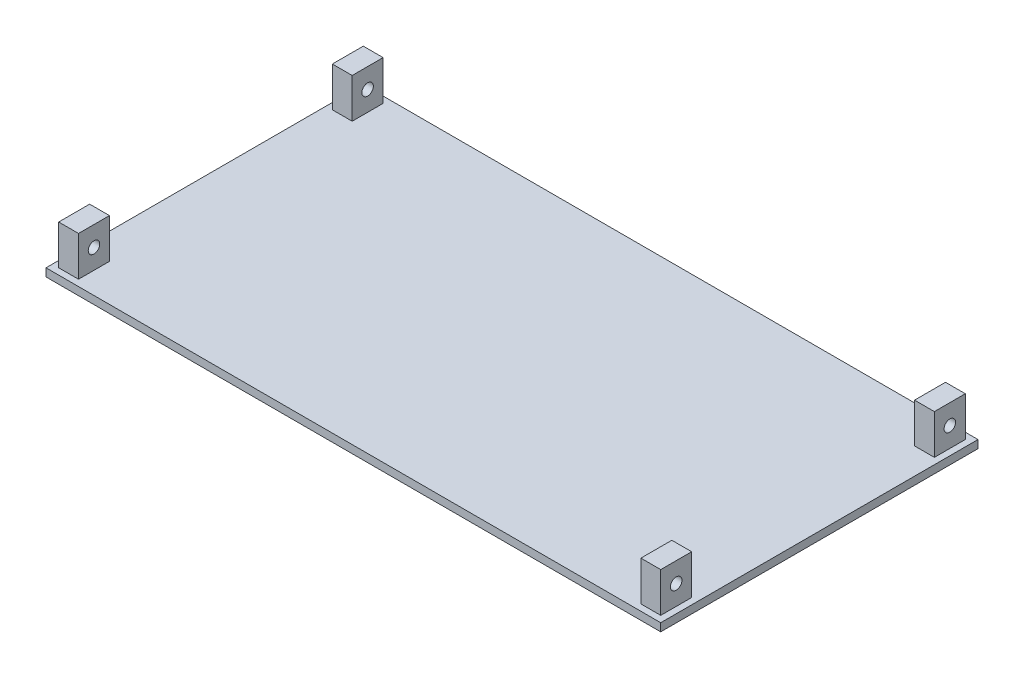
ISO-10303-21;
HEADER;
FILE_DESCRIPTION(('STEP AP214'),'2;1');
FILE_NAME('part.step','',(''),(''),'','','');
FILE_SCHEMA(('AUTOMOTIVE_DESIGN { 1 0 10303 214 1 1 1 1 }'));
ENDSEC;
DATA;
#1=APPLICATION_CONTEXT('core data for automotive mechanical design processes');
#2=APPLICATION_PROTOCOL_DEFINITION('international standard','automotive_design',2000,#1);
#3=PRODUCT_CONTEXT('',#1,'mechanical');
#4=PRODUCT('Part','Part','',(#3));
#5=PRODUCT_RELATED_PRODUCT_CATEGORY('part','',(#4));
#6=PRODUCT_DEFINITION_FORMATION('','',#4);
#7=PRODUCT_DEFINITION_CONTEXT('part definition',#1,'design');
#8=PRODUCT_DEFINITION('design','',#6,#7);
#9=PRODUCT_DEFINITION_SHAPE('','',#8);
#10=(LENGTH_UNIT() NAMED_UNIT(*) SI_UNIT(.MILLI.,.METRE.));
#11=(NAMED_UNIT(*) PLANE_ANGLE_UNIT() SI_UNIT($,.RADIAN.));
#12=(NAMED_UNIT(*) SI_UNIT($,.STERADIAN.) SOLID_ANGLE_UNIT());
#13=UNCERTAINTY_MEASURE_WITH_UNIT(LENGTH_MEASURE(1.E-05),#10,'distance_accuracy_value','');
#14=(GEOMETRIC_REPRESENTATION_CONTEXT(3) GLOBAL_UNCERTAINTY_ASSIGNED_CONTEXT((#13)) GLOBAL_UNIT_ASSIGNED_CONTEXT((#10,
#11,#12)) REPRESENTATION_CONTEXT('',''));
#15=CARTESIAN_POINT('',(0.,0.,0.));
#16=DIRECTION('',(0.,0.,1.));
#17=DIRECTION('',(1.,0.,0.));
#18=AXIS2_PLACEMENT_3D('',#15,#16,#17);
#19=CARTESIAN_POINT('',(0.,2.,0.));
#20=DIRECTION('',(0.,1.,0.));
#21=DIRECTION('',(0.,0.,1.));
#22=AXIS2_PLACEMENT_3D('',#19,#20,#21);
#23=PLANE('',#22);
#24=DIRECTION('',(0.,0.,-1.));
#25=VECTOR('',#24,1.);
#26=CARTESIAN_POINT('',(0.,2.,0.));
#27=LINE('',#26,#25);
#28=CARTESIAN_POINT('',(0.,2.,0.));
#29=VERTEX_POINT('',#28);
#30=CARTESIAN_POINT('',(0.,2.,-80.));
#31=VERTEX_POINT('',#30);
#32=EDGE_CURVE('E287',#29,#31,#27,.T.);
#33=ORIENTED_EDGE('',*,*,#32,.T.);
#34=DIRECTION('',(-1.,0.,0.));
#35=VECTOR('',#34,1.);
#36=CARTESIAN_POINT('',(0.,2.,-80.));
#37=LINE('',#36,#35);
#38=CARTESIAN_POINT('',(-155.,2.,-80.));
#39=VERTEX_POINT('',#38);
#40=EDGE_CURVE('E290',#31,#39,#37,.T.);
#41=ORIENTED_EDGE('',*,*,#40,.T.);
#42=DIRECTION('',(0.,0.,1.));
#43=VECTOR('',#42,1.);
#44=CARTESIAN_POINT('',(-155.,2.,0.));
#45=LINE('',#44,#43);
#46=CARTESIAN_POINT('',(-155.,2.,0.));
#47=VERTEX_POINT('',#46);
#48=EDGE_CURVE('E293',#39,#47,#45,.T.);
#49=ORIENTED_EDGE('',*,*,#48,.T.);
#50=DIRECTION('',(1.,0.,0.));
#51=VECTOR('',#50,1.);
#52=CARTESIAN_POINT('',(0.,2.,0.));
#53=LINE('',#52,#51);
#54=EDGE_CURVE('E295',#47,#29,#53,.T.);
#55=ORIENTED_EDGE('',*,*,#54,.T.);
#56=EDGE_LOOP('',(#33,#41,#49,#55));
#57=FACE_BOUND('',#56,.T.);
#58=DIRECTION('',(0.,0.,1.));
#59=VECTOR('',#58,1.);
#60=CARTESIAN_POINT('',(-153.4,2.,-78.4));
#61=LINE('',#60,#59);
#62=CARTESIAN_POINT('',(-153.4,2.,-78.4));
#63=VERTEX_POINT('',#62);
#64=CARTESIAN_POINT('',(-153.4,2.,-70.6));
#65=VERTEX_POINT('',#64);
#66=EDGE_CURVE('E271',#63,#65,#61,.T.);
#67=ORIENTED_EDGE('',*,*,#66,.F.);
#68=DIRECTION('',(-1.,0.,0.));
#69=VECTOR('',#68,1.);
#70=CARTESIAN_POINT('',(-153.4,2.,-78.4));
#71=LINE('',#70,#69);
#72=CARTESIAN_POINT('',(-148.4,2.,-78.4));
#73=VERTEX_POINT('',#72);
#74=EDGE_CURVE('E257',#73,#63,#71,.T.);
#75=ORIENTED_EDGE('',*,*,#74,.F.);
#76=DIRECTION('',(0.,0.,-1.));
#77=VECTOR('',#76,1.);
#78=CARTESIAN_POINT('',(-148.4,2.,-78.4));
#79=LINE('',#78,#77);
#80=CARTESIAN_POINT('',(-148.4,2.,-70.6));
#81=VERTEX_POINT('',#80);
#82=EDGE_CURVE('E262',#81,#73,#79,.T.);
#83=ORIENTED_EDGE('',*,*,#82,.F.);
#84=DIRECTION('',(1.,0.,0.));
#85=VECTOR('',#84,1.);
#86=CARTESIAN_POINT('',(-153.4,2.,-70.6));
#87=LINE('',#86,#85);
#88=EDGE_CURVE('E273',#65,#81,#87,.T.);
#89=ORIENTED_EDGE('',*,*,#88,.F.);
#90=EDGE_LOOP('',(#67,#75,#83,#89));
#91=FACE_BOUND('',#90,.T.);
#92=DIRECTION('',(1.,0.,0.));
#93=VECTOR('',#92,1.);
#94=CARTESIAN_POINT('',(-153.4,2.,-1.59999999999998));
#95=LINE('',#94,#93);
#96=CARTESIAN_POINT('',(-153.4,2.,-1.59999999999998));
#97=VERTEX_POINT('',#96);
#98=CARTESIAN_POINT('',(-148.4,2.,-1.59999999999998));
#99=VERTEX_POINT('',#98);
#100=EDGE_CURVE('E242',#97,#99,#95,.T.);
#101=ORIENTED_EDGE('',*,*,#100,.F.);
#102=DIRECTION('',(0.,0.,1.));
#103=VECTOR('',#102,1.);
#104=CARTESIAN_POINT('',(-153.4,2.,-1.59999999999998));
#105=LINE('',#104,#103);
#106=CARTESIAN_POINT('',(-153.4,2.,-9.39999999999998));
#107=VERTEX_POINT('',#106);
#108=EDGE_CURVE('E228',#107,#97,#105,.T.);
#109=ORIENTED_EDGE('',*,*,#108,.F.);
#110=DIRECTION('',(-1.,0.,0.));
#111=VECTOR('',#110,1.);
#112=CARTESIAN_POINT('',(-153.4,2.,-9.39999999999998));
#113=LINE('',#112,#111);
#114=CARTESIAN_POINT('',(-148.4,2.,-9.39999999999998));
#115=VERTEX_POINT('',#114);
#116=EDGE_CURVE('E233',#115,#107,#113,.T.);
#117=ORIENTED_EDGE('',*,*,#116,.F.);
#118=DIRECTION('',(0.,0.,-1.));
#119=VECTOR('',#118,1.);
#120=CARTESIAN_POINT('',(-148.4,2.,-1.59999999999998));
#121=LINE('',#120,#119);
#122=EDGE_CURVE('E244',#99,#115,#121,.T.);
#123=ORIENTED_EDGE('',*,*,#122,.F.);
#124=EDGE_LOOP('',(#101,#109,#117,#123));
#125=FACE_BOUND('',#124,.T.);
#126=DIRECTION('',(0.,0.,1.));
#127=VECTOR('',#126,1.);
#128=CARTESIAN_POINT('',(-6.60000000000008,2.,-78.4));
#129=LINE('',#128,#127);
#130=CARTESIAN_POINT('',(-6.60000000000008,2.,-78.4));
#131=VERTEX_POINT('',#130);
#132=CARTESIAN_POINT('',(-6.60000000000005,2.,-70.6));
#133=VERTEX_POINT('',#132);
#134=EDGE_CURVE('E200',#131,#133,#129,.T.);
#135=ORIENTED_EDGE('',*,*,#134,.F.);
#136=DIRECTION('',(-1.,0.,0.));
#137=VECTOR('',#136,1.);
#138=CARTESIAN_POINT('',(-1.60000000000007,2.,-78.4));
#139=LINE('',#138,#137);
#140=CARTESIAN_POINT('',(-1.60000000000007,2.,-78.4));
#141=VERTEX_POINT('',#140);
#142=EDGE_CURVE('E197',#141,#131,#139,.T.);
#143=ORIENTED_EDGE('',*,*,#142,.F.);
#144=DIRECTION('',(0.,0.,-1.));
#145=VECTOR('',#144,1.);
#146=CARTESIAN_POINT('',(-1.60000000000007,2.,-78.4));
#147=LINE('',#146,#145);
#148=CARTESIAN_POINT('',(-1.60000000000005,2.,-70.6));
#149=VERTEX_POINT('',#148);
#150=EDGE_CURVE('E209',#149,#141,#147,.T.);
#151=ORIENTED_EDGE('',*,*,#150,.F.);
#152=DIRECTION('',(1.,0.,0.));
#153=VECTOR('',#152,1.);
#154=CARTESIAN_POINT('',(-1.60000000000005,2.,-70.6));
#155=LINE('',#154,#153);
#156=EDGE_CURVE('E217',#133,#149,#155,.T.);
#157=ORIENTED_EDGE('',*,*,#156,.F.);
#158=EDGE_LOOP('',(#135,#143,#151,#157));
#159=FACE_BOUND('',#158,.T.);
#160=DIRECTION('',(0.,0.,-1.));
#161=VECTOR('',#160,1.);
#162=CARTESIAN_POINT('',(-1.59999999999999,2.,-1.59999999999998));
#163=LINE('',#162,#161);
#164=CARTESIAN_POINT('',(-1.59999999999999,2.,-1.59999999999998));
#165=VERTEX_POINT('',#164);
#166=CARTESIAN_POINT('',(-1.59999999999999,2.,-9.39999999999998));
#167=VERTEX_POINT('',#166);
#168=EDGE_CURVE('E594',#165,#167,#163,.T.);
#169=ORIENTED_EDGE('',*,*,#168,.F.);
#170=DIRECTION('',(1.,0.,0.));
#171=VECTOR('',#170,1.);
#172=CARTESIAN_POINT('',(-1.59999999999999,2.,-1.59999999999998));
#173=LINE('',#172,#171);
#174=CARTESIAN_POINT('',(-6.59999999999999,2.,-1.59999999999998));
#175=VERTEX_POINT('',#174);
#176=EDGE_CURVE('E195',#175,#165,#173,.T.);
#177=ORIENTED_EDGE('',*,*,#176,.F.);
#178=DIRECTION('',(0.,0.,1.));
#179=VECTOR('',#178,1.);
#180=CARTESIAN_POINT('',(-6.59999999999999,2.,-1.59999999999998));
#181=LINE('',#180,#179);
#182=CARTESIAN_POINT('',(-6.59999999999999,2.,-9.39999999999998));
#183=VERTEX_POINT('',#182);
#184=EDGE_CURVE('E191',#183,#175,#181,.T.);
#185=ORIENTED_EDGE('',*,*,#184,.F.);
#186=DIRECTION('',(-1.,0.,0.));
#187=VECTOR('',#186,1.);
#188=CARTESIAN_POINT('',(-1.59999999999999,2.,-9.39999999999998));
#189=LINE('',#188,#187);
#190=EDGE_CURVE('E596',#167,#183,#189,.T.);
#191=ORIENTED_EDGE('',*,*,#190,.F.);
#192=EDGE_LOOP('',(#169,#177,#185,#191));
#193=FACE_BOUND('',#192,.T.);
#194=ADVANCED_FACE('F33',(#57,#91,#125,#159,#193),#23,.T.);
#195=CARTESIAN_POINT('',(0.,2.,0.));
#196=DIRECTION('',(-1.,0.,0.));
#197=DIRECTION('',(0.,0.,1.));
#198=AXIS2_PLACEMENT_3D('',#195,#196,#197);
#199=PLANE('',#198);
#200=DIRECTION('',(0.,0.,-1.));
#201=VECTOR('',#200,1.);
#202=CARTESIAN_POINT('',(0.,0.,0.));
#203=LINE('',#202,#201);
#204=CARTESIAN_POINT('',(0.,0.,0.));
#205=VERTEX_POINT('',#204);
#206=CARTESIAN_POINT('',(0.,0.,-80.));
#207=VERTEX_POINT('',#206);
#208=EDGE_CURVE('E286',#205,#207,#203,.T.);
#209=ORIENTED_EDGE('',*,*,#208,.T.);
#210=DIRECTION('',(0.,-1.,0.));
#211=VECTOR('',#210,1.);
#212=CARTESIAN_POINT('',(0.,2.,-80.));
#213=LINE('',#212,#211);
#214=EDGE_CURVE('E11',#31,#207,#213,.T.);
#215=ORIENTED_EDGE('',*,*,#214,.F.);
#216=ORIENTED_EDGE('',*,*,#32,.F.);
#217=DIRECTION('',(0.,-1.,0.));
#218=VECTOR('',#217,1.);
#219=CARTESIAN_POINT('',(0.,2.,0.));
#220=LINE('',#219,#218);
#221=EDGE_CURVE('E297',#29,#205,#220,.T.);
#222=ORIENTED_EDGE('',*,*,#221,.T.);
#223=EDGE_LOOP('',(#209,#215,#216,#222));
#224=FACE_BOUND('',#223,.T.);
#225=ADVANCED_FACE('F35',(#224),#199,.F.);
#226=CARTESIAN_POINT('',(0.,2.,-80.));
#227=DIRECTION('',(0.,0.,1.));
#228=DIRECTION('',(1.,0.,0.));
#229=AXIS2_PLACEMENT_3D('',#226,#227,#228);
#230=PLANE('',#229);
#231=DIRECTION('',(-1.,0.,0.));
#232=VECTOR('',#231,1.);
#233=CARTESIAN_POINT('',(0.,0.,-80.));
#234=LINE('',#233,#232);
#235=CARTESIAN_POINT('',(-155.,0.,-80.));
#236=VERTEX_POINT('',#235);
#237=EDGE_CURVE('E300',#207,#236,#234,.T.);
#238=ORIENTED_EDGE('',*,*,#237,.T.);
#239=DIRECTION('',(0.,-1.,0.));
#240=VECTOR('',#239,1.);
#241=CARTESIAN_POINT('',(-155.,2.,-80.));
#242=LINE('',#241,#240);
#243=EDGE_CURVE('E42',#39,#236,#242,.T.);
#244=ORIENTED_EDGE('',*,*,#243,.F.);
#245=ORIENTED_EDGE('',*,*,#40,.F.);
#246=ORIENTED_EDGE('',*,*,#214,.T.);
#247=EDGE_LOOP('',(#238,#244,#245,#246));
#248=FACE_BOUND('',#247,.T.);
#249=ADVANCED_FACE('F331',(#248),#230,.F.);
#250=CARTESIAN_POINT('',(-155.,2.,0.));
#251=DIRECTION('',(1.,0.,0.));
#252=DIRECTION('',(0.,0.,-1.));
#253=AXIS2_PLACEMENT_3D('',#250,#251,#252);
#254=PLANE('',#253);
#255=DIRECTION('',(0.,0.,1.));
#256=VECTOR('',#255,1.);
#257=CARTESIAN_POINT('',(-155.,0.,0.));
#258=LINE('',#257,#256);
#259=CARTESIAN_POINT('',(-155.,0.,0.));
#260=VERTEX_POINT('',#259);
#261=EDGE_CURVE('E302',#236,#260,#258,.T.);
#262=ORIENTED_EDGE('',*,*,#261,.T.);
#263=DIRECTION('',(0.,-1.,0.));
#264=VECTOR('',#263,1.);
#265=CARTESIAN_POINT('',(-155.,2.,0.));
#266=LINE('',#265,#264);
#267=EDGE_CURVE('E307',#47,#260,#266,.T.);
#268=ORIENTED_EDGE('',*,*,#267,.F.);
#269=ORIENTED_EDGE('',*,*,#48,.F.);
#270=ORIENTED_EDGE('',*,*,#243,.T.);
#271=EDGE_LOOP('',(#262,#268,#269,#270));
#272=FACE_BOUND('',#271,.T.);
#273=ADVANCED_FACE('F315',(#272),#254,.F.);
#274=CARTESIAN_POINT('',(0.,2.,0.));
#275=DIRECTION('',(0.,0.,-1.));
#276=DIRECTION('',(-1.,0.,0.));
#277=AXIS2_PLACEMENT_3D('',#274,#275,#276);
#278=PLANE('',#277);
#279=DIRECTION('',(1.,0.,0.));
#280=VECTOR('',#279,1.);
#281=CARTESIAN_POINT('',(0.,0.,0.));
#282=LINE('',#281,#280);
#283=EDGE_CURVE('E291',#260,#205,#282,.T.);
#284=ORIENTED_EDGE('',*,*,#283,.T.);
#285=ORIENTED_EDGE('',*,*,#221,.F.);
#286=ORIENTED_EDGE('',*,*,#54,.F.);
#287=ORIENTED_EDGE('',*,*,#267,.T.);
#288=EDGE_LOOP('',(#284,#285,#286,#287));
#289=FACE_BOUND('',#288,.T.);
#290=ADVANCED_FACE('F324',(#289),#278,.F.);
#291=CARTESIAN_POINT('',(0.,0.,0.));
#292=DIRECTION('',(0.,1.,0.));
#293=DIRECTION('',(0.,0.,1.));
#294=AXIS2_PLACEMENT_3D('',#291,#292,#293);
#295=PLANE('',#294);
#296=ORIENTED_EDGE('',*,*,#208,.F.);
#297=ORIENTED_EDGE('',*,*,#283,.F.);
#298=ORIENTED_EDGE('',*,*,#261,.F.);
#299=ORIENTED_EDGE('',*,*,#237,.F.);
#300=EDGE_LOOP('',(#296,#297,#298,#299));
#301=FACE_BOUND('',#300,.T.);
#302=ADVANCED_FACE('F321',(#301),#295,.F.);
#303=CARTESIAN_POINT('',(-153.4,12.,-78.4));
#304=DIRECTION('',(0.,0.,1.));
#305=DIRECTION('',(1.,0.,0.));
#306=AXIS2_PLACEMENT_3D('',#303,#304,#305);
#307=PLANE('',#306);
#308=ORIENTED_EDGE('',*,*,#74,.T.);
#309=DIRECTION('',(0.,-1.,0.));
#310=VECTOR('',#309,1.);
#311=CARTESIAN_POINT('',(-153.4,12.,-78.4));
#312=LINE('',#311,#310);
#313=CARTESIAN_POINT('',(-153.4,12.,-78.4));
#314=VERTEX_POINT('',#313);
#315=EDGE_CURVE('E284',#314,#63,#312,.T.);
#316=ORIENTED_EDGE('',*,*,#315,.F.);
#317=DIRECTION('',(-1.,0.,0.));
#318=VECTOR('',#317,1.);
#319=CARTESIAN_POINT('',(-153.4,12.,-78.4));
#320=LINE('',#319,#318);
#321=CARTESIAN_POINT('',(-148.4,12.,-78.4));
#322=VERTEX_POINT('',#321);
#323=EDGE_CURVE('E258',#322,#314,#320,.T.);
#324=ORIENTED_EDGE('',*,*,#323,.F.);
#325=DIRECTION('',(0.,-1.,0.));
#326=VECTOR('',#325,1.);
#327=CARTESIAN_POINT('',(-148.4,12.,-78.4));
#328=LINE('',#327,#326);
#329=EDGE_CURVE('E268',#322,#73,#328,.T.);
#330=ORIENTED_EDGE('',*,*,#329,.T.);
#331=EDGE_LOOP('',(#308,#316,#324,#330));
#332=FACE_BOUND('',#331,.T.);
#333=ADVANCED_FACE('F344',(#332),#307,.F.);
#334=CARTESIAN_POINT('',(-153.4,12.,-78.4));
#335=DIRECTION('',(1.,0.,0.));
#336=DIRECTION('',(0.,0.,-1.));
#337=AXIS2_PLACEMENT_3D('',#334,#335,#336);
#338=PLANE('',#337);
#339=CARTESIAN_POINT('',(-153.4,7.,-74.4999999999994));
#340=DIRECTION('',(1.,0.,0.));
#341=DIRECTION('',(0.,0.,-1.));
#342=AXIS2_PLACEMENT_3D('',#339,#340,#341);
#343=CIRCLE('',#342,1.45);
#344=CARTESIAN_POINT('',(-153.4,7.,-75.9499999999994));
#345=VERTEX_POINT('',#344);
#346=EDGE_CURVE('E575',#345,#345,#343,.T.);
#347=ORIENTED_EDGE('',*,*,#346,.T.);
#348=EDGE_LOOP('',(#347));
#349=FACE_BOUND('',#348,.T.);
#350=ORIENTED_EDGE('',*,*,#66,.T.);
#351=DIRECTION('',(0.,-1.,0.));
#352=VECTOR('',#351,1.);
#353=CARTESIAN_POINT('',(-153.4,12.,-70.6));
#354=LINE('',#353,#352);
#355=CARTESIAN_POINT('',(-153.4,12.,-70.6));
#356=VERTEX_POINT('',#355);
#357=EDGE_CURVE('E281',#356,#65,#354,.T.);
#358=ORIENTED_EDGE('',*,*,#357,.F.);
#359=DIRECTION('',(0.,0.,1.));
#360=VECTOR('',#359,1.);
#361=CARTESIAN_POINT('',(-153.4,12.,-78.4));
#362=LINE('',#361,#360);
#363=EDGE_CURVE('E261',#314,#356,#362,.T.);
#364=ORIENTED_EDGE('',*,*,#363,.F.);
#365=ORIENTED_EDGE('',*,*,#315,.T.);
#366=EDGE_LOOP('',(#350,#358,#364,#365));
#367=FACE_BOUND('',#366,.T.);
#368=ADVANCED_FACE('F363',(#349,#367),#338,.F.);
#369=CARTESIAN_POINT('',(-153.4,12.,-70.6));
#370=DIRECTION('',(0.,0.,-1.));
#371=DIRECTION('',(-1.,0.,0.));
#372=AXIS2_PLACEMENT_3D('',#369,#370,#371);
#373=PLANE('',#372);
#374=ORIENTED_EDGE('',*,*,#88,.T.);
#375=DIRECTION('',(0.,-1.,0.));
#376=VECTOR('',#375,1.);
#377=CARTESIAN_POINT('',(-148.4,12.,-70.6));
#378=LINE('',#377,#376);
#379=CARTESIAN_POINT('',(-148.4,12.,-70.6));
#380=VERTEX_POINT('',#379);
#381=EDGE_CURVE('E279',#380,#81,#378,.T.);
#382=ORIENTED_EDGE('',*,*,#381,.F.);
#383=DIRECTION('',(1.,0.,0.));
#384=VECTOR('',#383,1.);
#385=CARTESIAN_POINT('',(-153.4,12.,-70.6));
#386=LINE('',#385,#384);
#387=EDGE_CURVE('E264',#356,#380,#386,.T.);
#388=ORIENTED_EDGE('',*,*,#387,.F.);
#389=ORIENTED_EDGE('',*,*,#357,.T.);
#390=EDGE_LOOP('',(#374,#382,#388,#389));
#391=FACE_BOUND('',#390,.T.);
#392=ADVANCED_FACE('F372',(#391),#373,.F.);
#393=CARTESIAN_POINT('',(-148.4,12.,-78.4));
#394=DIRECTION('',(-1.,0.,0.));
#395=DIRECTION('',(0.,0.,1.));
#396=AXIS2_PLACEMENT_3D('',#393,#394,#395);
#397=PLANE('',#396);
#398=CARTESIAN_POINT('',(-148.4,7.,-74.4999999999995));
#399=DIRECTION('',(-1.,0.,0.));
#400=DIRECTION('',(0.,0.,1.));
#401=AXIS2_PLACEMENT_3D('',#398,#399,#400);
#402=CIRCLE('',#401,1.45);
#403=CARTESIAN_POINT('',(-148.4,7.,-73.0499999999994));
#404=VERTEX_POINT('',#403);
#405=EDGE_CURVE('E572',#404,#404,#402,.T.);
#406=ORIENTED_EDGE('',*,*,#405,.T.);
#407=EDGE_LOOP('',(#406));
#408=FACE_BOUND('',#407,.T.);
#409=ORIENTED_EDGE('',*,*,#82,.T.);
#410=ORIENTED_EDGE('',*,*,#329,.F.);
#411=DIRECTION('',(0.,0.,-1.));
#412=VECTOR('',#411,1.);
#413=CARTESIAN_POINT('',(-148.4,12.,-78.4));
#414=LINE('',#413,#412);
#415=EDGE_CURVE('E266',#380,#322,#414,.T.);
#416=ORIENTED_EDGE('',*,*,#415,.F.);
#417=ORIENTED_EDGE('',*,*,#381,.T.);
#418=EDGE_LOOP('',(#409,#410,#416,#417));
#419=FACE_BOUND('',#418,.T.);
#420=ADVANCED_FACE('F382',(#408,#419),#397,.F.);
#421=CARTESIAN_POINT('',(0.,12.,0.));
#422=DIRECTION('',(0.,-1.,0.));
#423=DIRECTION('',(0.,0.,-1.));
#424=AXIS2_PLACEMENT_3D('',#421,#422,#423);
#425=PLANE('',#424);
#426=ORIENTED_EDGE('',*,*,#323,.T.);
#427=ORIENTED_EDGE('',*,*,#363,.T.);
#428=ORIENTED_EDGE('',*,*,#387,.T.);
#429=ORIENTED_EDGE('',*,*,#415,.T.);
#430=EDGE_LOOP('',(#426,#427,#428,#429));
#431=FACE_BOUND('',#430,.T.);
#432=ADVANCED_FACE('F390',(#431),#425,.F.);
#433=CARTESIAN_POINT('',(-153.4,12.,-1.59999999999998));
#434=DIRECTION('',(1.,0.,0.));
#435=DIRECTION('',(0.,0.,-1.));
#436=AXIS2_PLACEMENT_3D('',#433,#434,#435);
#437=PLANE('',#436);
#438=CARTESIAN_POINT('',(-153.4,7.,-5.49999999999998));
#439=DIRECTION('',(-1.,0.,0.));
#440=DIRECTION('',(0.,0.,1.));
#441=AXIS2_PLACEMENT_3D('',#438,#439,#440);
#442=CIRCLE('',#441,1.45);
#443=CARTESIAN_POINT('',(-153.4,7.,-4.04999999999998));
#444=VERTEX_POINT('',#443);
#445=EDGE_CURVE('E576',#444,#444,#442,.T.);
#446=ORIENTED_EDGE('',*,*,#445,.F.);
#447=EDGE_LOOP('',(#446));
#448=FACE_BOUND('',#447,.T.);
#449=ORIENTED_EDGE('',*,*,#108,.T.);
#450=DIRECTION('',(0.,-1.,0.));
#451=VECTOR('',#450,1.);
#452=CARTESIAN_POINT('',(-153.4,12.,-1.59999999999998));
#453=LINE('',#452,#451);
#454=CARTESIAN_POINT('',(-153.4,12.,-1.59999999999998));
#455=VERTEX_POINT('',#454);
#456=EDGE_CURVE('E255',#455,#97,#453,.T.);
#457=ORIENTED_EDGE('',*,*,#456,.F.);
#458=DIRECTION('',(0.,0.,1.));
#459=VECTOR('',#458,1.);
#460=CARTESIAN_POINT('',(-153.4,12.,-1.59999999999998));
#461=LINE('',#460,#459);
#462=CARTESIAN_POINT('',(-153.4,12.,-9.39999999999998));
#463=VERTEX_POINT('',#462);
#464=EDGE_CURVE('E229',#463,#455,#461,.T.);
#465=ORIENTED_EDGE('',*,*,#464,.F.);
#466=DIRECTION('',(0.,-1.,0.));
#467=VECTOR('',#466,1.);
#468=CARTESIAN_POINT('',(-153.4,12.,-9.39999999999998));
#469=LINE('',#468,#467);
#470=EDGE_CURVE('E239',#463,#107,#469,.T.);
#471=ORIENTED_EDGE('',*,*,#470,.T.);
#472=EDGE_LOOP('',(#449,#457,#465,#471));
#473=FACE_BOUND('',#472,.T.);
#474=ADVANCED_FACE('F400',(#448,#473),#437,.F.);
#475=CARTESIAN_POINT('',(-153.4,12.,-1.59999999999998));
#476=DIRECTION('',(0.,0.,-1.));
#477=DIRECTION('',(-1.,0.,0.));
#478=AXIS2_PLACEMENT_3D('',#475,#476,#477);
#479=PLANE('',#478);
#480=ORIENTED_EDGE('',*,*,#100,.T.);
#481=DIRECTION('',(0.,-1.,0.));
#482=VECTOR('',#481,1.);
#483=CARTESIAN_POINT('',(-148.4,12.,-1.59999999999998));
#484=LINE('',#483,#482);
#485=CARTESIAN_POINT('',(-148.4,12.,-1.59999999999998));
#486=VERTEX_POINT('',#485);
#487=EDGE_CURVE('E252',#486,#99,#484,.T.);
#488=ORIENTED_EDGE('',*,*,#487,.F.);
#489=DIRECTION('',(1.,0.,0.));
#490=VECTOR('',#489,1.);
#491=CARTESIAN_POINT('',(-153.4,12.,-1.59999999999998));
#492=LINE('',#491,#490);
#493=EDGE_CURVE('E232',#455,#486,#492,.T.);
#494=ORIENTED_EDGE('',*,*,#493,.F.);
#495=ORIENTED_EDGE('',*,*,#456,.T.);
#496=EDGE_LOOP('',(#480,#488,#494,#495));
#497=FACE_BOUND('',#496,.T.);
#498=ADVANCED_FACE('F408',(#497),#479,.F.);
#499=CARTESIAN_POINT('',(-148.4,12.,-1.59999999999998));
#500=DIRECTION('',(-1.,0.,0.));
#501=DIRECTION('',(0.,0.,1.));
#502=AXIS2_PLACEMENT_3D('',#499,#500,#501);
#503=PLANE('',#502);
#504=CARTESIAN_POINT('',(-148.4,7.,-5.49999999999998));
#505=DIRECTION('',(-1.,0.,0.));
#506=DIRECTION('',(0.,0.,1.));
#507=AXIS2_PLACEMENT_3D('',#504,#505,#506);
#508=CIRCLE('',#507,1.45);
#509=CARTESIAN_POINT('',(-148.4,7.,-4.04999999999998));
#510=VERTEX_POINT('',#509);
#511=EDGE_CURVE('E587',#510,#510,#508,.T.);
#512=ORIENTED_EDGE('',*,*,#511,.T.);
#513=EDGE_LOOP('',(#512));
#514=FACE_BOUND('',#513,.T.);
#515=ORIENTED_EDGE('',*,*,#122,.T.);
#516=DIRECTION('',(0.,-1.,0.));
#517=VECTOR('',#516,1.);
#518=CARTESIAN_POINT('',(-148.4,12.,-9.39999999999998));
#519=LINE('',#518,#517);
#520=CARTESIAN_POINT('',(-148.4,12.,-9.39999999999998));
#521=VERTEX_POINT('',#520);
#522=EDGE_CURVE('E250',#521,#115,#519,.T.);
#523=ORIENTED_EDGE('',*,*,#522,.F.);
#524=DIRECTION('',(0.,0.,-1.));
#525=VECTOR('',#524,1.);
#526=CARTESIAN_POINT('',(-148.4,12.,-1.59999999999998));
#527=LINE('',#526,#525);
#528=EDGE_CURVE('E235',#486,#521,#527,.T.);
#529=ORIENTED_EDGE('',*,*,#528,.F.);
#530=ORIENTED_EDGE('',*,*,#487,.T.);
#531=EDGE_LOOP('',(#515,#523,#529,#530));
#532=FACE_BOUND('',#531,.T.);
#533=ADVANCED_FACE('F417',(#514,#532),#503,.F.);
#534=CARTESIAN_POINT('',(-153.4,12.,-9.39999999999998));
#535=DIRECTION('',(0.,0.,1.));
#536=DIRECTION('',(1.,0.,0.));
#537=AXIS2_PLACEMENT_3D('',#534,#535,#536);
#538=PLANE('',#537);
#539=ORIENTED_EDGE('',*,*,#116,.T.);
#540=ORIENTED_EDGE('',*,*,#470,.F.);
#541=DIRECTION('',(-1.,0.,0.));
#542=VECTOR('',#541,1.);
#543=CARTESIAN_POINT('',(-153.4,12.,-9.39999999999998));
#544=LINE('',#543,#542);
#545=EDGE_CURVE('E237',#521,#463,#544,.T.);
#546=ORIENTED_EDGE('',*,*,#545,.F.);
#547=ORIENTED_EDGE('',*,*,#522,.T.);
#548=EDGE_LOOP('',(#539,#540,#546,#547));
#549=FACE_BOUND('',#548,.T.);
#550=ADVANCED_FACE('F425',(#549),#538,.F.);
#551=CARTESIAN_POINT('',(0.,12.,0.));
#552=DIRECTION('',(0.,-1.,0.));
#553=DIRECTION('',(0.,0.,-1.));
#554=AXIS2_PLACEMENT_3D('',#551,#552,#553);
#555=PLANE('',#554);
#556=ORIENTED_EDGE('',*,*,#464,.T.);
#557=ORIENTED_EDGE('',*,*,#493,.T.);
#558=ORIENTED_EDGE('',*,*,#528,.T.);
#559=ORIENTED_EDGE('',*,*,#545,.T.);
#560=EDGE_LOOP('',(#556,#557,#558,#559));
#561=FACE_BOUND('',#560,.T.);
#562=ADVANCED_FACE('F433',(#561),#555,.F.);
#563=CARTESIAN_POINT('',(-1.60000000000007,12.,-78.4));
#564=DIRECTION('',(0.,0.,1.));
#565=DIRECTION('',(1.,0.,0.));
#566=AXIS2_PLACEMENT_3D('',#563,#564,#565);
#567=PLANE('',#566);
#568=ORIENTED_EDGE('',*,*,#142,.T.);
#569=DIRECTION('',(0.,-1.,0.));
#570=VECTOR('',#569,1.);
#571=CARTESIAN_POINT('',(-6.60000000000008,12.,-78.4));
#572=LINE('',#571,#570);
#573=CARTESIAN_POINT('',(-6.60000000000008,12.,-78.4));
#574=VERTEX_POINT('',#573);
#575=EDGE_CURVE('E226',#574,#131,#572,.T.);
#576=ORIENTED_EDGE('',*,*,#575,.F.);
#577=DIRECTION('',(-1.,0.,0.));
#578=VECTOR('',#577,1.);
#579=CARTESIAN_POINT('',(-1.60000000000007,12.,-78.4));
#580=LINE('',#579,#578);
#581=CARTESIAN_POINT('',(-1.60000000000007,12.,-78.4));
#582=VERTEX_POINT('',#581);
#583=EDGE_CURVE('E205',#582,#574,#580,.T.);
#584=ORIENTED_EDGE('',*,*,#583,.F.);
#585=DIRECTION('',(0.,-1.,0.));
#586=VECTOR('',#585,1.);
#587=CARTESIAN_POINT('',(-1.60000000000007,12.,-78.4));
#588=LINE('',#587,#586);
#589=EDGE_CURVE('E214',#582,#141,#588,.T.);
#590=ORIENTED_EDGE('',*,*,#589,.T.);
#591=EDGE_LOOP('',(#568,#576,#584,#590));
#592=FACE_BOUND('',#591,.T.);
#593=ADVANCED_FACE('F441',(#592),#567,.F.);
#594=CARTESIAN_POINT('',(-6.60000000000008,12.,-78.4));
#595=DIRECTION('',(1.,0.,0.));
#596=DIRECTION('',(0.,0.,-1.));
#597=AXIS2_PLACEMENT_3D('',#594,#595,#596);
#598=PLANE('',#597);
#599=CARTESIAN_POINT('',(-6.60000000000005,7.,-74.5));
#600=DIRECTION('',(1.,0.,0.));
#601=DIRECTION('',(0.,0.,-1.));
#602=AXIS2_PLACEMENT_3D('',#599,#600,#601);
#603=CIRCLE('',#602,1.45);
#604=CARTESIAN_POINT('',(-6.60000000000006,7.,-75.95));
#605=VERTEX_POINT('',#604);
#606=EDGE_CURVE('E580',#605,#605,#603,.T.);
#607=ORIENTED_EDGE('',*,*,#606,.T.);
#608=EDGE_LOOP('',(#607));
#609=FACE_BOUND('',#608,.T.);
#610=ORIENTED_EDGE('',*,*,#134,.T.);
#611=DIRECTION('',(0.,-1.,0.));
#612=VECTOR('',#611,1.);
#613=CARTESIAN_POINT('',(-6.60000000000005,12.,-70.6));
#614=LINE('',#613,#612);
#615=CARTESIAN_POINT('',(-6.60000000000005,12.,-70.6));
#616=VERTEX_POINT('',#615);
#617=EDGE_CURVE('E223',#616,#133,#614,.T.);
#618=ORIENTED_EDGE('',*,*,#617,.F.);
#619=DIRECTION('',(0.,0.,1.));
#620=VECTOR('',#619,1.);
#621=CARTESIAN_POINT('',(-6.60000000000008,12.,-78.4));
#622=LINE('',#621,#620);
#623=EDGE_CURVE('E208',#574,#616,#622,.T.);
#624=ORIENTED_EDGE('',*,*,#623,.F.);
#625=ORIENTED_EDGE('',*,*,#575,.T.);
#626=EDGE_LOOP('',(#610,#618,#624,#625));
#627=FACE_BOUND('',#626,.T.);
#628=ADVANCED_FACE('F449',(#609,#627),#598,.F.);
#629=CARTESIAN_POINT('',(-1.60000000000005,12.,-70.6));
#630=DIRECTION('',(0.,0.,-1.));
#631=DIRECTION('',(-1.,0.,0.));
#632=AXIS2_PLACEMENT_3D('',#629,#630,#631);
#633=PLANE('',#632);
#634=ORIENTED_EDGE('',*,*,#156,.T.);
#635=DIRECTION('',(0.,-1.,0.));
#636=VECTOR('',#635,1.);
#637=CARTESIAN_POINT('',(-1.60000000000005,12.,-70.6));
#638=LINE('',#637,#636);
#639=CARTESIAN_POINT('',(-1.60000000000005,12.,-70.6));
#640=VERTEX_POINT('',#639);
#641=EDGE_CURVE('E57',#640,#149,#638,.T.);
#642=ORIENTED_EDGE('',*,*,#641,.F.);
#643=DIRECTION('',(1.,0.,0.));
#644=VECTOR('',#643,1.);
#645=CARTESIAN_POINT('',(-1.60000000000005,12.,-70.6));
#646=LINE('',#645,#644);
#647=EDGE_CURVE('E211',#616,#640,#646,.T.);
#648=ORIENTED_EDGE('',*,*,#647,.F.);
#649=ORIENTED_EDGE('',*,*,#617,.T.);
#650=EDGE_LOOP('',(#634,#642,#648,#649));
#651=FACE_BOUND('',#650,.T.);
#652=ADVANCED_FACE('F458',(#651),#633,.F.);
#653=CARTESIAN_POINT('',(-1.60000000000007,12.,-78.4));
#654=DIRECTION('',(-1.,0.,0.));
#655=DIRECTION('',(0.,0.,1.));
#656=AXIS2_PLACEMENT_3D('',#653,#654,#655);
#657=PLANE('',#656);
#658=CARTESIAN_POINT('',(-1.60000000000006,7.,-74.5));
#659=DIRECTION('',(1.,0.,0.));
#660=DIRECTION('',(0.,0.,-1.));
#661=AXIS2_PLACEMENT_3D('',#658,#659,#660);
#662=CIRCLE('',#661,1.45);
#663=CARTESIAN_POINT('',(-1.60000000000006,7.,-75.95));
#664=VERTEX_POINT('',#663);
#665=EDGE_CURVE('E635',#664,#664,#662,.T.);
#666=ORIENTED_EDGE('',*,*,#665,.F.);
#667=EDGE_LOOP('',(#666));
#668=FACE_BOUND('',#667,.T.);
#669=ORIENTED_EDGE('',*,*,#150,.T.);
#670=ORIENTED_EDGE('',*,*,#589,.F.);
#671=DIRECTION('',(0.,0.,-1.));
#672=VECTOR('',#671,1.);
#673=CARTESIAN_POINT('',(-1.60000000000007,12.,-78.4));
#674=LINE('',#673,#672);
#675=EDGE_CURVE('E213',#640,#582,#674,.T.);
#676=ORIENTED_EDGE('',*,*,#675,.F.);
#677=ORIENTED_EDGE('',*,*,#641,.T.);
#678=EDGE_LOOP('',(#669,#670,#676,#677));
#679=FACE_BOUND('',#678,.T.);
#680=ADVANCED_FACE('F468',(#668,#679),#657,.F.);
#681=CARTESIAN_POINT('',(0.,12.,0.));
#682=DIRECTION('',(0.,1.,0.));
#683=DIRECTION('',(0.,0.,1.));
#684=AXIS2_PLACEMENT_3D('',#681,#682,#683);
#685=PLANE('',#684);
#686=ORIENTED_EDGE('',*,*,#583,.T.);
#687=ORIENTED_EDGE('',*,*,#623,.T.);
#688=ORIENTED_EDGE('',*,*,#647,.T.);
#689=ORIENTED_EDGE('',*,*,#675,.T.);
#690=EDGE_LOOP('',(#686,#687,#688,#689));
#691=FACE_BOUND('',#690,.T.);
#692=ADVANCED_FACE('F476',(#691),#685,.T.);
#693=CARTESIAN_POINT('',(-1.59999999999999,12.,-1.59999999999998));
#694=DIRECTION('',(0.,0.,-1.));
#695=DIRECTION('',(-1.,0.,0.));
#696=AXIS2_PLACEMENT_3D('',#693,#694,#695);
#697=PLANE('',#696);
#698=ORIENTED_EDGE('',*,*,#176,.T.);
#699=DIRECTION('',(0.,-1.,0.));
#700=VECTOR('',#699,1.);
#701=CARTESIAN_POINT('',(-1.59999999999999,12.,-1.59999999999998));
#702=LINE('',#701,#700);
#703=CARTESIAN_POINT('',(-1.59999999999999,12.,-1.59999999999998));
#704=VERTEX_POINT('',#703);
#705=EDGE_CURVE('E176',#704,#165,#702,.T.);
#706=ORIENTED_EDGE('',*,*,#705,.F.);
#707=DIRECTION('',(1.,0.,0.));
#708=VECTOR('',#707,1.);
#709=CARTESIAN_POINT('',(-1.59999999999999,12.,-1.59999999999998));
#710=LINE('',#709,#708);
#711=CARTESIAN_POINT('',(-6.59999999999999,12.,-1.59999999999998));
#712=VERTEX_POINT('',#711);
#713=EDGE_CURVE('E183',#712,#704,#710,.T.);
#714=ORIENTED_EDGE('',*,*,#713,.F.);
#715=DIRECTION('',(0.,-1.,0.));
#716=VECTOR('',#715,1.);
#717=CARTESIAN_POINT('',(-6.59999999999999,12.,-1.59999999999998));
#718=LINE('',#717,#716);
#719=EDGE_CURVE('E592',#712,#175,#718,.T.);
#720=ORIENTED_EDGE('',*,*,#719,.T.);
#721=EDGE_LOOP('',(#698,#706,#714,#720));
#722=FACE_BOUND('',#721,.T.);
#723=ADVANCED_FACE('F193',(#722),#697,.F.);
#724=CARTESIAN_POINT('',(-1.59999999999999,12.,-1.59999999999998));
#725=DIRECTION('',(-1.,0.,0.));
#726=DIRECTION('',(0.,0.,1.));
#727=AXIS2_PLACEMENT_3D('',#724,#725,#726);
#728=PLANE('',#727);
#729=CARTESIAN_POINT('',(-1.59999999999999,7.,-5.49999999999998));
#730=DIRECTION('',(-1.,0.,0.));
#731=DIRECTION('',(0.,0.,1.));
#732=AXIS2_PLACEMENT_3D('',#729,#730,#731);
#733=CIRCLE('',#732,1.45);
#734=CARTESIAN_POINT('',(-1.59999999999999,7.,-4.04999999999998));
#735=VERTEX_POINT('',#734);
#736=EDGE_CURVE('E584',#735,#735,#733,.T.);
#737=ORIENTED_EDGE('',*,*,#736,.T.);
#738=EDGE_LOOP('',(#737));
#739=FACE_BOUND('',#738,.T.);
#740=ORIENTED_EDGE('',*,*,#168,.T.);
#741=DIRECTION('',(0.,-1.,0.));
#742=VECTOR('',#741,1.);
#743=CARTESIAN_POINT('',(-1.59999999999999,12.,-9.39999999999998));
#744=LINE('',#743,#742);
#745=CARTESIAN_POINT('',(-1.59999999999999,12.,-9.39999999999998));
#746=VERTEX_POINT('',#745);
#747=EDGE_CURVE('E179',#746,#167,#744,.T.);
#748=ORIENTED_EDGE('',*,*,#747,.F.);
#749=DIRECTION('',(0.,0.,-1.));
#750=VECTOR('',#749,1.);
#751=CARTESIAN_POINT('',(-1.59999999999999,12.,-1.59999999999998));
#752=LINE('',#751,#750);
#753=EDGE_CURVE('E172',#704,#746,#752,.T.);
#754=ORIENTED_EDGE('',*,*,#753,.F.);
#755=ORIENTED_EDGE('',*,*,#705,.T.);
#756=EDGE_LOOP('',(#740,#748,#754,#755));
#757=FACE_BOUND('',#756,.T.);
#758=ADVANCED_FACE('F174',(#739,#757),#728,.F.);
#759=CARTESIAN_POINT('',(-1.59999999999999,12.,-9.39999999999998));
#760=DIRECTION('',(0.,0.,1.));
#761=DIRECTION('',(1.,0.,0.));
#762=AXIS2_PLACEMENT_3D('',#759,#760,#761);
#763=PLANE('',#762);
#764=ORIENTED_EDGE('',*,*,#190,.T.);
#765=DIRECTION('',(0.,-1.,0.));
#766=VECTOR('',#765,1.);
#767=CARTESIAN_POINT('',(-6.59999999999999,12.,-9.39999999999998));
#768=LINE('',#767,#766);
#769=CARTESIAN_POINT('',(-6.59999999999999,12.,-9.39999999999998));
#770=VERTEX_POINT('',#769);
#771=EDGE_CURVE('E49',#770,#183,#768,.T.);
#772=ORIENTED_EDGE('',*,*,#771,.F.);
#773=DIRECTION('',(-1.,0.,0.));
#774=VECTOR('',#773,1.);
#775=CARTESIAN_POINT('',(-1.59999999999999,12.,-9.39999999999998));
#776=LINE('',#775,#774);
#777=EDGE_CURVE('E182',#746,#770,#776,.T.);
#778=ORIENTED_EDGE('',*,*,#777,.F.);
#779=ORIENTED_EDGE('',*,*,#747,.T.);
#780=EDGE_LOOP('',(#764,#772,#778,#779));
#781=FACE_BOUND('',#780,.T.);
#782=ADVANCED_FACE('F498',(#781),#763,.F.);
#783=CARTESIAN_POINT('',(-6.59999999999999,12.,-1.59999999999998));
#784=DIRECTION('',(1.,0.,0.));
#785=DIRECTION('',(0.,0.,-1.));
#786=AXIS2_PLACEMENT_3D('',#783,#784,#785);
#787=PLANE('',#786);
#788=CARTESIAN_POINT('',(-6.59999999999999,7.,-5.49999999999998));
#789=DIRECTION('',(1.,0.,0.));
#790=DIRECTION('',(0.,0.,-1.));
#791=AXIS2_PLACEMENT_3D('',#788,#789,#790);
#792=CIRCLE('',#791,1.45);
#793=CARTESIAN_POINT('',(-6.59999999999999,7.,-6.94999999999998));
#794=VERTEX_POINT('',#793);
#795=EDGE_CURVE('E37',#794,#794,#792,.T.);
#796=ORIENTED_EDGE('',*,*,#795,.T.);
#797=EDGE_LOOP('',(#796));
#798=FACE_BOUND('',#797,.T.);
#799=ORIENTED_EDGE('',*,*,#184,.T.);
#800=ORIENTED_EDGE('',*,*,#719,.F.);
#801=DIRECTION('',(0.,0.,1.));
#802=VECTOR('',#801,1.);
#803=CARTESIAN_POINT('',(-6.59999999999999,12.,-1.59999999999998));
#804=LINE('',#803,#802);
#805=EDGE_CURVE('E187',#770,#712,#804,.T.);
#806=ORIENTED_EDGE('',*,*,#805,.F.);
#807=ORIENTED_EDGE('',*,*,#771,.T.);
#808=EDGE_LOOP('',(#799,#800,#806,#807));
#809=FACE_BOUND('',#808,.T.);
#810=ADVANCED_FACE('F506',(#798,#809),#787,.F.);
#811=CARTESIAN_POINT('',(0.,12.,0.));
#812=DIRECTION('',(0.,-1.,0.));
#813=DIRECTION('',(0.,0.,-1.));
#814=AXIS2_PLACEMENT_3D('',#811,#812,#813);
#815=PLANE('',#814);
#816=ORIENTED_EDGE('',*,*,#713,.T.);
#817=ORIENTED_EDGE('',*,*,#753,.T.);
#818=ORIENTED_EDGE('',*,*,#777,.T.);
#819=ORIENTED_EDGE('',*,*,#805,.T.);
#820=EDGE_LOOP('',(#816,#817,#818,#819));
#821=FACE_BOUND('',#820,.T.);
#822=ADVANCED_FACE('F186',(#821),#815,.F.);
#823=CARTESIAN_POINT('',(56.6,7.,-5.49999999999998));
#824=DIRECTION('',(-1.,0.,0.));
#825=DIRECTION('',(0.,0.,1.));
#826=AXIS2_PLACEMENT_3D('',#823,#824,#825);
#827=CYLINDRICAL_SURFACE('',#826,1.45);
#828=ORIENTED_EDGE('',*,*,#795,.F.);
#829=EDGE_LOOP('',(#828));
#830=FACE_BOUND('',#829,.T.);
#831=ORIENTED_EDGE('',*,*,#736,.F.);
#832=EDGE_LOOP('',(#831));
#833=FACE_BOUND('',#832,.T.);
#834=ADVANCED_FACE('F520',(#830,#833),#827,.F.);
#835=ORIENTED_EDGE('',*,*,#445,.T.);
#836=EDGE_LOOP('',(#835));
#837=FACE_BOUND('',#836,.T.);
#838=ORIENTED_EDGE('',*,*,#511,.F.);
#839=EDGE_LOOP('',(#838));
#840=FACE_BOUND('',#839,.T.);
#841=ADVANCED_FACE('F526',(#837,#840),#827,.F.);
#842=CARTESIAN_POINT('',(-211.6,7.,-74.4999999999992));
#843=DIRECTION('',(1.,0.,0.));
#844=DIRECTION('',(0.,0.,-1.));
#845=AXIS2_PLACEMENT_3D('',#842,#843,#844);
#846=CYLINDRICAL_SURFACE('',#845,1.45);
#847=ORIENTED_EDGE('',*,*,#665,.T.);
#848=EDGE_LOOP('',(#847));
#849=FACE_BOUND('',#848,.T.);
#850=ORIENTED_EDGE('',*,*,#606,.F.);
#851=EDGE_LOOP('',(#850));
#852=FACE_BOUND('',#851,.T.);
#853=ADVANCED_FACE('F533',(#849,#852),#846,.F.);
#854=ORIENTED_EDGE('',*,*,#405,.F.);
#855=EDGE_LOOP('',(#854));
#856=FACE_BOUND('',#855,.T.);
#857=ORIENTED_EDGE('',*,*,#346,.F.);
#858=EDGE_LOOP('',(#857));
#859=FACE_BOUND('',#858,.T.);
#860=ADVANCED_FACE('F539',(#856,#859),#846,.F.);
#861=CLOSED_SHELL('',(#194,#225,#249,#273,#290,#302,#333,#368,#392,#420,#432,#474,#498,#533,
#550,#562,#593,#628,#652,#680,#692,#723,#758,#782,#810,#822,#834,#841,#853,#860));
#862=MANIFOLD_SOLID_BREP('B2',#861);
#863=ADVANCED_BREP_SHAPE_REPRESENTATION('',(#18,#862),#14);
#864=SHAPE_DEFINITION_REPRESENTATION(#9,#863);
ENDSEC;
END-ISO-10303-21;
